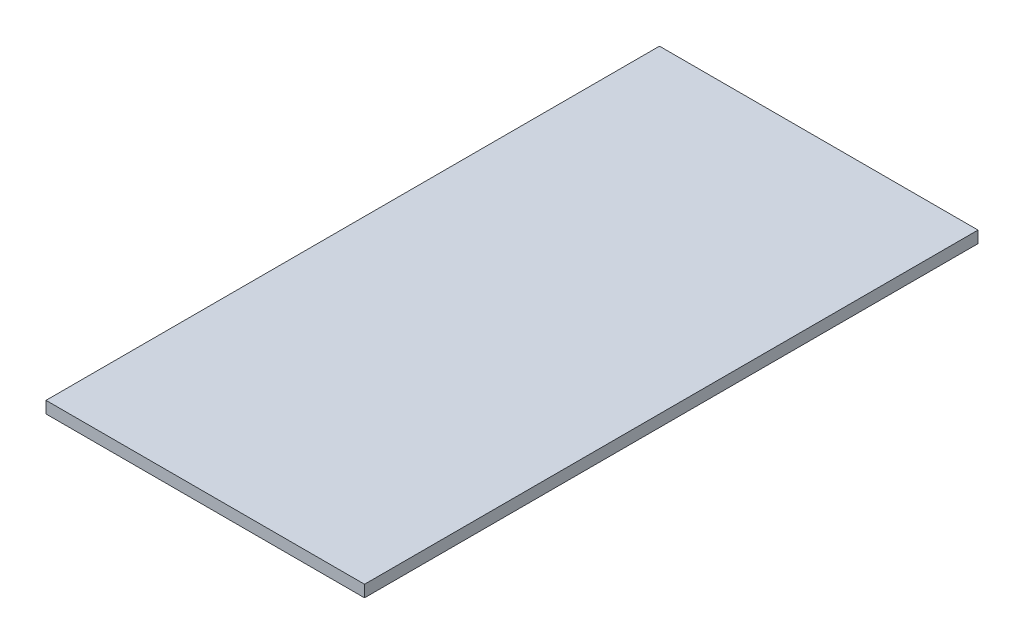
ISO-10303-21;
HEADER;
FILE_DESCRIPTION(('STEP AP214'),'2;1');
FILE_NAME('part.step','',(''),(''),'','','');
FILE_SCHEMA(('AUTOMOTIVE_DESIGN { 1 0 10303 214 1 1 1 1 }'));
ENDSEC;
DATA;
#1=APPLICATION_CONTEXT('core data for automotive mechanical design processes');
#2=APPLICATION_PROTOCOL_DEFINITION('international standard','automotive_design',2000,#1);
#3=PRODUCT_CONTEXT('',#1,'mechanical');
#4=PRODUCT('Part','Part','',(#3));
#5=PRODUCT_RELATED_PRODUCT_CATEGORY('part','',(#4));
#6=PRODUCT_DEFINITION_FORMATION('','',#4);
#7=PRODUCT_DEFINITION_CONTEXT('part definition',#1,'design');
#8=PRODUCT_DEFINITION('design','',#6,#7);
#9=PRODUCT_DEFINITION_SHAPE('','',#8);
#10=(LENGTH_UNIT() NAMED_UNIT(*) SI_UNIT(.MILLI.,.METRE.));
#11=(NAMED_UNIT(*) PLANE_ANGLE_UNIT() SI_UNIT($,.RADIAN.));
#12=(NAMED_UNIT(*) SI_UNIT($,.STERADIAN.) SOLID_ANGLE_UNIT());
#13=UNCERTAINTY_MEASURE_WITH_UNIT(LENGTH_MEASURE(1.E-05),#10,'distance_accuracy_value','');
#14=(GEOMETRIC_REPRESENTATION_CONTEXT(3) GLOBAL_UNCERTAINTY_ASSIGNED_CONTEXT((#13)) GLOBAL_UNIT_ASSIGNED_CONTEXT((#10,
#11,#12)) REPRESENTATION_CONTEXT('',''));
#15=CARTESIAN_POINT('',(0.,0.,0.));
#16=DIRECTION('',(0.,0.,1.));
#17=DIRECTION('',(1.,0.,0.));
#18=AXIS2_PLACEMENT_3D('',#15,#16,#17);
#19=CARTESIAN_POINT('',(-4114.8,304.8,7924.8));
#20=DIRECTION('',(1.,0.,0.));
#21=DIRECTION('',(0.,0.,-1.));
#22=AXIS2_PLACEMENT_3D('',#19,#20,#21);
#23=PLANE('',#22);
#24=DIRECTION('',(0.,0.,1.));
#25=VECTOR('',#24,1.);
#26=CARTESIAN_POINT('',(-4114.8,0.,7924.8));
#27=LINE('',#26,#25);
#28=CARTESIAN_POINT('',(-4114.8,0.,-7924.8));
#29=VERTEX_POINT('',#28);
#30=CARTESIAN_POINT('',(-4114.8,0.,7924.8));
#31=VERTEX_POINT('',#30);
#32=EDGE_CURVE('E98',#29,#31,#27,.T.);
#33=ORIENTED_EDGE('',*,*,#32,.T.);
#34=DIRECTION('',(0.,-1.,0.));
#35=VECTOR('',#34,1.);
#36=CARTESIAN_POINT('',(-4114.8,304.8,7924.8));
#37=LINE('',#36,#35);
#38=CARTESIAN_POINT('',(-4114.8,304.8,7924.8));
#39=VERTEX_POINT('',#38);
#40=EDGE_CURVE('E11',#39,#31,#37,.T.);
#41=ORIENTED_EDGE('',*,*,#40,.F.);
#42=DIRECTION('',(0.,0.,1.));
#43=VECTOR('',#42,1.);
#44=CARTESIAN_POINT('',(-4114.8,304.8,7924.8));
#45=LINE('',#44,#43);
#46=CARTESIAN_POINT('',(-4114.8,304.8,-7924.8));
#47=VERTEX_POINT('',#46);
#48=EDGE_CURVE('E86',#47,#39,#45,.T.);
#49=ORIENTED_EDGE('',*,*,#48,.F.);
#50=DIRECTION('',(0.,-1.,0.));
#51=VECTOR('',#50,1.);
#52=CARTESIAN_POINT('',(-4114.8,304.8,-7924.8));
#53=LINE('',#52,#51);
#54=EDGE_CURVE('E94',#47,#29,#53,.T.);
#55=ORIENTED_EDGE('',*,*,#54,.T.);
#56=EDGE_LOOP('',(#33,#41,#49,#55));
#57=FACE_BOUND('',#56,.T.);
#58=ADVANCED_FACE('F35',(#57),#23,.F.);
#59=CARTESIAN_POINT('',(4114.8,304.8,7924.8));
#60=DIRECTION('',(0.,0.,-1.));
#61=DIRECTION('',(-1.,0.,0.));
#62=AXIS2_PLACEMENT_3D('',#59,#60,#61);
#63=PLANE('',#62);
#64=DIRECTION('',(1.,0.,0.));
#65=VECTOR('',#64,1.);
#66=CARTESIAN_POINT('',(4114.8,0.,7924.8));
#67=LINE('',#66,#65);
#68=CARTESIAN_POINT('',(4114.8,0.,7924.8));
#69=VERTEX_POINT('',#68);
#70=EDGE_CURVE('E90',#31,#69,#67,.T.);
#71=ORIENTED_EDGE('',*,*,#70,.T.);
#72=DIRECTION('',(0.,-1.,0.));
#73=VECTOR('',#72,1.);
#74=CARTESIAN_POINT('',(4114.8,304.8,7924.8));
#75=LINE('',#74,#73);
#76=CARTESIAN_POINT('',(4114.8,304.8,7924.8));
#77=VERTEX_POINT('',#76);
#78=EDGE_CURVE('E43',#77,#69,#75,.T.);
#79=ORIENTED_EDGE('',*,*,#78,.F.);
#80=DIRECTION('',(1.,0.,0.));
#81=VECTOR('',#80,1.);
#82=CARTESIAN_POINT('',(4114.8,304.8,7924.8));
#83=LINE('',#82,#81);
#84=EDGE_CURVE('E81',#39,#77,#83,.T.);
#85=ORIENTED_EDGE('',*,*,#84,.F.);
#86=ORIENTED_EDGE('',*,*,#40,.T.);
#87=EDGE_LOOP('',(#71,#79,#85,#86));
#88=FACE_BOUND('',#87,.T.);
#89=ADVANCED_FACE('F89',(#88),#63,.F.);
#90=CARTESIAN_POINT('',(4114.8,304.8,7924.8));
#91=DIRECTION('',(-1.,0.,0.));
#92=DIRECTION('',(0.,0.,1.));
#93=AXIS2_PLACEMENT_3D('',#90,#91,#92);
#94=PLANE('',#93);
#95=DIRECTION('',(0.,0.,-1.));
#96=VECTOR('',#95,1.);
#97=CARTESIAN_POINT('',(4114.8,0.,7924.8));
#98=LINE('',#97,#96);
#99=CARTESIAN_POINT('',(4114.8,0.,-7924.8));
#100=VERTEX_POINT('',#99);
#101=EDGE_CURVE('E68',#69,#100,#98,.T.);
#102=ORIENTED_EDGE('',*,*,#101,.T.);
#103=DIRECTION('',(0.,-1.,0.));
#104=VECTOR('',#103,1.);
#105=CARTESIAN_POINT('',(4114.8,304.8,-7924.8));
#106=LINE('',#105,#104);
#107=CARTESIAN_POINT('',(4114.8,304.8,-7924.8));
#108=VERTEX_POINT('',#107);
#109=EDGE_CURVE('E91',#108,#100,#106,.T.);
#110=ORIENTED_EDGE('',*,*,#109,.F.);
#111=DIRECTION('',(0.,0.,-1.));
#112=VECTOR('',#111,1.);
#113=CARTESIAN_POINT('',(4114.8,304.8,7924.8));
#114=LINE('',#113,#112);
#115=EDGE_CURVE('E84',#77,#108,#114,.T.);
#116=ORIENTED_EDGE('',*,*,#115,.F.);
#117=ORIENTED_EDGE('',*,*,#78,.T.);
#118=EDGE_LOOP('',(#102,#110,#116,#117));
#119=FACE_BOUND('',#118,.T.);
#120=ADVANCED_FACE('F92',(#119),#94,.F.);
#121=CARTESIAN_POINT('',(4114.8,304.8,-7924.8));
#122=DIRECTION('',(0.,0.,1.));
#123=DIRECTION('',(1.,0.,0.));
#124=AXIS2_PLACEMENT_3D('',#121,#122,#123);
#125=PLANE('',#124);
#126=DIRECTION('',(-1.,0.,0.));
#127=VECTOR('',#126,1.);
#128=CARTESIAN_POINT('',(4114.8,0.,-7924.8));
#129=LINE('',#128,#127);
#130=EDGE_CURVE('E74',#100,#29,#129,.T.);
#131=ORIENTED_EDGE('',*,*,#130,.T.);
#132=ORIENTED_EDGE('',*,*,#54,.F.);
#133=DIRECTION('',(-1.,0.,0.));
#134=VECTOR('',#133,1.);
#135=CARTESIAN_POINT('',(4114.8,304.8,-7924.8));
#136=LINE('',#135,#134);
#137=EDGE_CURVE('E51',#108,#47,#136,.T.);
#138=ORIENTED_EDGE('',*,*,#137,.F.);
#139=ORIENTED_EDGE('',*,*,#109,.T.);
#140=EDGE_LOOP('',(#131,#132,#138,#139));
#141=FACE_BOUND('',#140,.T.);
#142=ADVANCED_FACE('F105',(#141),#125,.F.);
#143=CARTESIAN_POINT('',(0.,304.8,0.));
#144=DIRECTION('',(0.,1.,0.));
#145=DIRECTION('',(0.,0.,1.));
#146=AXIS2_PLACEMENT_3D('',#143,#144,#145);
#147=PLANE('',#146);
#148=ORIENTED_EDGE('',*,*,#48,.T.);
#149=ORIENTED_EDGE('',*,*,#84,.T.);
#150=ORIENTED_EDGE('',*,*,#115,.T.);
#151=ORIENTED_EDGE('',*,*,#137,.T.);
#152=EDGE_LOOP('',(#148,#149,#150,#151));
#153=FACE_BOUND('',#152,.T.);
#154=ADVANCED_FACE('F82',(#153),#147,.T.);
#155=CARTESIAN_POINT('',(0.,0.,0.));
#156=DIRECTION('',(0.,1.,0.));
#157=DIRECTION('',(0.,0.,1.));
#158=AXIS2_PLACEMENT_3D('',#155,#156,#157);
#159=PLANE('',#158);
#160=ORIENTED_EDGE('',*,*,#32,.F.);
#161=ORIENTED_EDGE('',*,*,#130,.F.);
#162=ORIENTED_EDGE('',*,*,#101,.F.);
#163=ORIENTED_EDGE('',*,*,#70,.F.);
#164=EDGE_LOOP('',(#160,#161,#162,#163));
#165=FACE_BOUND('',#164,.T.);
#166=ADVANCED_FACE('F108',(#165),#159,.F.);
#167=CLOSED_SHELL('',(#58,#89,#120,#142,#154,#166));
#168=MANIFOLD_SOLID_BREP('B2',#167);
#169=ADVANCED_BREP_SHAPE_REPRESENTATION('',(#18,#168),#14);
#170=SHAPE_DEFINITION_REPRESENTATION(#9,#169);
ENDSEC;
END-ISO-10303-21;
